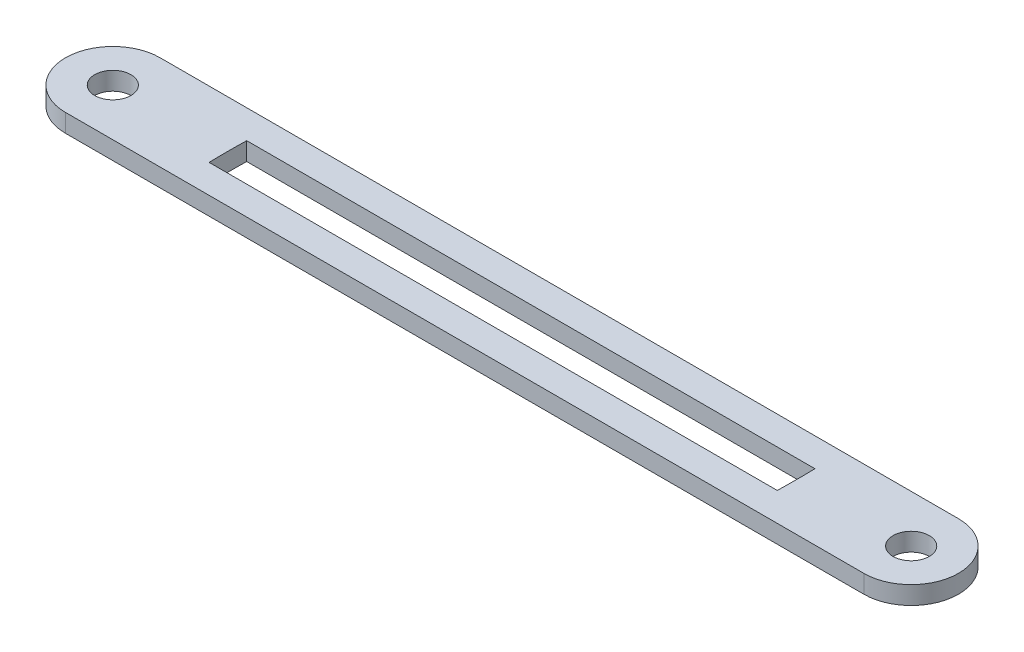
ISO-10303-21;
HEADER;
FILE_DESCRIPTION(('STEP AP214'),'2;1');
FILE_NAME('part.step','',(''),(''),'','','');
FILE_SCHEMA(('AUTOMOTIVE_DESIGN { 1 0 10303 214 1 1 1 1 }'));
ENDSEC;
DATA;
#1=APPLICATION_CONTEXT('core data for automotive mechanical design processes');
#2=APPLICATION_PROTOCOL_DEFINITION('international standard','automotive_design',2000,#1);
#3=PRODUCT_CONTEXT('',#1,'mechanical');
#4=PRODUCT('Part','Part','',(#3));
#5=PRODUCT_RELATED_PRODUCT_CATEGORY('part','',(#4));
#6=PRODUCT_DEFINITION_FORMATION('','',#4);
#7=PRODUCT_DEFINITION_CONTEXT('part definition',#1,'design');
#8=PRODUCT_DEFINITION('design','',#6,#7);
#9=PRODUCT_DEFINITION_SHAPE('','',#8);
#10=(LENGTH_UNIT() NAMED_UNIT(*) SI_UNIT(.MILLI.,.METRE.));
#11=(NAMED_UNIT(*) PLANE_ANGLE_UNIT() SI_UNIT($,.RADIAN.));
#12=(NAMED_UNIT(*) SI_UNIT($,.STERADIAN.) SOLID_ANGLE_UNIT());
#13=UNCERTAINTY_MEASURE_WITH_UNIT(LENGTH_MEASURE(1.E-05),#10,'distance_accuracy_value','');
#14=(GEOMETRIC_REPRESENTATION_CONTEXT(3) GLOBAL_UNCERTAINTY_ASSIGNED_CONTEXT((#13)) GLOBAL_UNIT_ASSIGNED_CONTEXT((#10,
#11,#12)) REPRESENTATION_CONTEXT('',''));
#15=CARTESIAN_POINT('',(0.,0.,0.));
#16=DIRECTION('',(0.,0.,1.));
#17=DIRECTION('',(1.,0.,0.));
#18=AXIS2_PLACEMENT_3D('',#15,#16,#17);
#19=CARTESIAN_POINT('',(0.,0.79375,4.15));
#20=DIRECTION('',(0.,0.,-1.));
#21=DIRECTION('',(-1.,0.,0.));
#22=AXIS2_PLACEMENT_3D('',#19,#20,#21);
#23=PLANE('',#22);
#24=DIRECTION('',(1.,0.,0.));
#25=VECTOR('',#24,1.);
#26=CARTESIAN_POINT('',(0.,-0.79375,4.15));
#27=LINE('',#26,#25);
#28=CARTESIAN_POINT('',(-35.,-0.79375,4.14999999999999));
#29=VERTEX_POINT('',#28);
#30=CARTESIAN_POINT('',(35.,-0.79375,4.15));
#31=VERTEX_POINT('',#30);
#32=EDGE_CURVE('E146',#29,#31,#27,.T.);
#33=ORIENTED_EDGE('',*,*,#32,.T.);
#34=DIRECTION('',(0.,-1.,0.));
#35=VECTOR('',#34,1.);
#36=CARTESIAN_POINT('',(35.,0.79375,4.15));
#37=LINE('',#36,#35);
#38=CARTESIAN_POINT('',(35.,0.79375,4.15));
#39=VERTEX_POINT('',#38);
#40=EDGE_CURVE('E11',#39,#31,#37,.T.);
#41=ORIENTED_EDGE('',*,*,#40,.F.);
#42=DIRECTION('',(1.,0.,0.));
#43=VECTOR('',#42,1.);
#44=CARTESIAN_POINT('',(0.,0.79375,4.15));
#45=LINE('',#44,#43);
#46=CARTESIAN_POINT('',(-35.,0.79375,4.14999999999999));
#47=VERTEX_POINT('',#46);
#48=EDGE_CURVE('E116',#47,#39,#45,.T.);
#49=ORIENTED_EDGE('',*,*,#48,.F.);
#50=DIRECTION('',(0.,-1.,0.));
#51=VECTOR('',#50,1.);
#52=CARTESIAN_POINT('',(-35.,0.79375,4.14999999999999));
#53=LINE('',#52,#51);
#54=EDGE_CURVE('E153',#47,#29,#53,.T.);
#55=ORIENTED_EDGE('',*,*,#54,.T.);
#56=EDGE_LOOP('',(#33,#41,#49,#55));
#57=FACE_BOUND('',#56,.T.);
#58=ADVANCED_FACE('F35',(#57),#23,.F.);
#59=CARTESIAN_POINT('',(35.,0.79375,0.));
#60=DIRECTION('',(0.,-1.,0.));
#61=DIRECTION('',(0.,0.,-1.));
#62=AXIS2_PLACEMENT_3D('',#59,#60,#61);
#63=CYLINDRICAL_SURFACE('',#62,4.15);
#64=CARTESIAN_POINT('',(35.,-0.79375,0.));
#65=DIRECTION('',(0.,1.,0.));
#66=DIRECTION('',(0.,0.,1.));
#67=AXIS2_PLACEMENT_3D('',#64,#65,#66);
#68=CIRCLE('',#67,4.15);
#69=CARTESIAN_POINT('',(35.,-0.79375,-4.15));
#70=VERTEX_POINT('',#69);
#71=EDGE_CURVE('E121',#31,#70,#68,.T.);
#72=ORIENTED_EDGE('',*,*,#71,.T.);
#73=DIRECTION('',(0.,-1.,0.));
#74=VECTOR('',#73,1.);
#75=CARTESIAN_POINT('',(35.,0.79375,-4.15));
#76=LINE('',#75,#74);
#77=CARTESIAN_POINT('',(35.,0.79375,-4.15));
#78=VERTEX_POINT('',#77);
#79=EDGE_CURVE('E45',#78,#70,#76,.T.);
#80=ORIENTED_EDGE('',*,*,#79,.F.);
#81=CARTESIAN_POINT('',(35.,0.79375,0.));
#82=DIRECTION('',(0.,1.,0.));
#83=DIRECTION('',(0.,0.,1.));
#84=AXIS2_PLACEMENT_3D('',#81,#82,#83);
#85=CIRCLE('',#84,4.15);
#86=EDGE_CURVE('E110',#39,#78,#85,.T.);
#87=ORIENTED_EDGE('',*,*,#86,.F.);
#88=ORIENTED_EDGE('',*,*,#40,.T.);
#89=EDGE_LOOP('',(#72,#80,#87,#88));
#90=FACE_BOUND('',#89,.T.);
#91=ADVANCED_FACE('F120',(#90),#63,.T.);
#92=CARTESIAN_POINT('',(0.,0.79375,-4.15));
#93=DIRECTION('',(0.,0.,1.));
#94=DIRECTION('',(1.,0.,0.));
#95=AXIS2_PLACEMENT_3D('',#92,#93,#94);
#96=PLANE('',#95);
#97=DIRECTION('',(-1.,0.,0.));
#98=VECTOR('',#97,1.);
#99=CARTESIAN_POINT('',(0.,-0.79375,-4.15));
#100=LINE('',#99,#98);
#101=CARTESIAN_POINT('',(-35.,-0.79375,-4.14999999999999));
#102=VERTEX_POINT('',#101);
#103=EDGE_CURVE('E83',#70,#102,#100,.T.);
#104=ORIENTED_EDGE('',*,*,#103,.T.);
#105=DIRECTION('',(0.,-1.,0.));
#106=VECTOR('',#105,1.);
#107=CARTESIAN_POINT('',(-35.,0.79375,-4.14999999999999));
#108=LINE('',#107,#106);
#109=CARTESIAN_POINT('',(-35.,0.79375,-4.14999999999999));
#110=VERTEX_POINT('',#109);
#111=EDGE_CURVE('E122',#110,#102,#108,.T.);
#112=ORIENTED_EDGE('',*,*,#111,.F.);
#113=DIRECTION('',(-1.,0.,0.));
#114=VECTOR('',#113,1.);
#115=CARTESIAN_POINT('',(0.,0.79375,-4.15));
#116=LINE('',#115,#114);
#117=EDGE_CURVE('E114',#78,#110,#116,.T.);
#118=ORIENTED_EDGE('',*,*,#117,.F.);
#119=ORIENTED_EDGE('',*,*,#79,.T.);
#120=EDGE_LOOP('',(#104,#112,#118,#119));
#121=FACE_BOUND('',#120,.T.);
#122=ADVANCED_FACE('F124',(#121),#96,.F.);
#123=CARTESIAN_POINT('',(35.,0.79375,0.));
#124=DIRECTION('',(0.,-1.,0.));
#125=DIRECTION('',(0.,0.,-1.));
#126=AXIS2_PLACEMENT_3D('',#123,#124,#125);
#127=CYLINDRICAL_SURFACE('',#126,59.9299769551078);
#128=CARTESIAN_POINT('',(35.,-0.79375,0.));
#129=DIRECTION('',(0.,1.,0.));
#130=DIRECTION('',(0.,0.,1.));
#131=AXIS2_PLACEMENT_3D('',#128,#129,#130);
#132=CIRCLE('',#131,59.9299769551078);
#133=CARTESIAN_POINT('',(-24.9072586406669,-0.79375,-1.64999999999999));
#134=VERTEX_POINT('',#133);
#135=CARTESIAN_POINT('',(-24.9072586406669,-0.79375,1.65));
#136=VERTEX_POINT('',#135);
#137=EDGE_CURVE('E130',#134,#136,#132,.T.);
#138=ORIENTED_EDGE('',*,*,#137,.F.);
#139=DIRECTION('',(0.,-1.,0.));
#140=VECTOR('',#139,1.);
#141=CARTESIAN_POINT('',(-24.9072586406669,0.79375,-1.64999999999999));
#142=LINE('',#141,#140);
#143=CARTESIAN_POINT('',(-24.9072586406669,0.79375,-1.64999999999999));
#144=VERTEX_POINT('',#143);
#145=EDGE_CURVE('E39',#144,#134,#142,.T.);
#146=ORIENTED_EDGE('',*,*,#145,.F.);
#147=CARTESIAN_POINT('',(35.,0.79375,0.));
#148=DIRECTION('',(0.,1.,0.));
#149=DIRECTION('',(0.,0.,1.));
#150=AXIS2_PLACEMENT_3D('',#147,#148,#149);
#151=CIRCLE('',#150,59.9299769551078);
#152=CARTESIAN_POINT('',(-24.9072586406669,0.79375,1.65));
#153=VERTEX_POINT('',#152);
#154=EDGE_CURVE('E152',#144,#153,#151,.T.);
#155=ORIENTED_EDGE('',*,*,#154,.T.);
#156=DIRECTION('',(0.,-1.,0.));
#157=VECTOR('',#156,1.);
#158=CARTESIAN_POINT('',(-24.9072586406669,0.79375,1.65));
#159=LINE('',#158,#157);
#160=EDGE_CURVE('E126',#153,#136,#159,.T.);
#161=ORIENTED_EDGE('',*,*,#160,.T.);
#162=EDGE_LOOP('',(#138,#146,#155,#161));
#163=FACE_BOUND('',#162,.T.);
#164=ADVANCED_FACE('F37',(#163),#127,.F.);
#165=CARTESIAN_POINT('',(0.,0.79375,-1.65));
#166=DIRECTION('',(0.,0.,-1.));
#167=DIRECTION('',(-1.,0.,0.));
#168=AXIS2_PLACEMENT_3D('',#165,#166,#167);
#169=PLANE('',#168);
#170=DIRECTION('',(1.,0.,0.));
#171=VECTOR('',#170,1.);
#172=CARTESIAN_POINT('',(0.,-0.79375,-1.65));
#173=LINE('',#172,#171);
#174=CARTESIAN_POINT('',(24.9072586406669,-0.79375,-1.65));
#175=VERTEX_POINT('',#174);
#176=EDGE_CURVE('E133',#134,#175,#173,.T.);
#177=ORIENTED_EDGE('',*,*,#176,.T.);
#178=DIRECTION('',(0.,-1.,0.));
#179=VECTOR('',#178,1.);
#180=CARTESIAN_POINT('',(24.9072586406669,0.79375,-1.65));
#181=LINE('',#180,#179);
#182=CARTESIAN_POINT('',(24.9072586406669,0.79375,-1.65));
#183=VERTEX_POINT('',#182);
#184=EDGE_CURVE('E159',#183,#175,#181,.T.);
#185=ORIENTED_EDGE('',*,*,#184,.F.);
#186=DIRECTION('',(1.,0.,0.));
#187=VECTOR('',#186,1.);
#188=CARTESIAN_POINT('',(0.,0.79375,-1.65));
#189=LINE('',#188,#187);
#190=EDGE_CURVE('E168',#144,#183,#189,.T.);
#191=ORIENTED_EDGE('',*,*,#190,.F.);
#192=ORIENTED_EDGE('',*,*,#145,.T.);
#193=EDGE_LOOP('',(#177,#185,#191,#192));
#194=FACE_BOUND('',#193,.T.);
#195=ADVANCED_FACE('F167',(#194),#169,.F.);
#196=CARTESIAN_POINT('',(-35.,0.79375,0.));
#197=DIRECTION('',(0.,-1.,0.));
#198=DIRECTION('',(0.,0.,-1.));
#199=AXIS2_PLACEMENT_3D('',#196,#197,#198);
#200=CYLINDRICAL_SURFACE('',#199,59.9299769551078);
#201=CARTESIAN_POINT('',(-35.,-0.79375,0.));
#202=DIRECTION('',(0.,1.,0.));
#203=DIRECTION('',(0.,0.,1.));
#204=AXIS2_PLACEMENT_3D('',#201,#202,#203);
#205=CIRCLE('',#204,59.9299769551078);
#206=CARTESIAN_POINT('',(24.9072586406669,-0.79375,1.64999999999999));
#207=VERTEX_POINT('',#206);
#208=EDGE_CURVE('E135',#175,#207,#205,.F.);
#209=ORIENTED_EDGE('',*,*,#208,.T.);
#210=DIRECTION('',(0.,-1.,0.));
#211=VECTOR('',#210,1.);
#212=CARTESIAN_POINT('',(24.9072586406669,0.79375,1.64999999999999));
#213=LINE('',#212,#211);
#214=CARTESIAN_POINT('',(24.9072586406669,0.79375,1.64999999999999));
#215=VERTEX_POINT('',#214);
#216=EDGE_CURVE('E157',#215,#207,#213,.T.);
#217=ORIENTED_EDGE('',*,*,#216,.F.);
#218=CARTESIAN_POINT('',(-35.,0.79375,0.));
#219=DIRECTION('',(0.,1.,0.));
#220=DIRECTION('',(0.,0.,1.));
#221=AXIS2_PLACEMENT_3D('',#218,#219,#220);
#222=CIRCLE('',#221,59.9299769551078);
#223=EDGE_CURVE('E181',#183,#215,#222,.F.);
#224=ORIENTED_EDGE('',*,*,#223,.F.);
#225=ORIENTED_EDGE('',*,*,#184,.T.);
#226=EDGE_LOOP('',(#209,#217,#224,#225));
#227=FACE_BOUND('',#226,.T.);
#228=ADVANCED_FACE('F180',(#227),#200,.F.);
#229=CARTESIAN_POINT('',(-35.,0.79375,0.));
#230=DIRECTION('',(0.,-1.,0.));
#231=DIRECTION('',(0.,0.,-1.));
#232=AXIS2_PLACEMENT_3D('',#229,#230,#231);
#233=CYLINDRICAL_SURFACE('',#232,1.5875);
#234=CARTESIAN_POINT('',(-35.,0.79375,0.));
#235=DIRECTION('',(0.,1.,0.));
#236=DIRECTION('',(0.,0.,1.));
#237=AXIS2_PLACEMENT_3D('',#234,#235,#236);
#238=CIRCLE('',#237,1.5875);
#239=CARTESIAN_POINT('',(-35.,0.79375,1.5875));
#240=VERTEX_POINT('',#239);
#241=EDGE_CURVE('E191',#240,#240,#238,.T.);
#242=ORIENTED_EDGE('',*,*,#241,.T.);
#243=EDGE_LOOP('',(#242));
#244=FACE_BOUND('',#243,.T.);
#245=CARTESIAN_POINT('',(-35.,-0.79375,0.));
#246=DIRECTION('',(0.,1.,0.));
#247=DIRECTION('',(0.,0.,1.));
#248=AXIS2_PLACEMENT_3D('',#245,#246,#247);
#249=CIRCLE('',#248,1.5875);
#250=CARTESIAN_POINT('',(-35.,-0.79375,1.5875));
#251=VERTEX_POINT('',#250);
#252=EDGE_CURVE('E143',#251,#251,#249,.T.);
#253=ORIENTED_EDGE('',*,*,#252,.F.);
#254=EDGE_LOOP('',(#253));
#255=FACE_BOUND('',#254,.T.);
#256=ADVANCED_FACE('F195',(#244,#255),#233,.F.);
#257=CARTESIAN_POINT('',(35.,0.79375,0.));
#258=DIRECTION('',(0.,-1.,0.));
#259=DIRECTION('',(0.,0.,-1.));
#260=AXIS2_PLACEMENT_3D('',#257,#258,#259);
#261=CYLINDRICAL_SURFACE('',#260,1.5875);
#262=CARTESIAN_POINT('',(35.,0.79375,0.));
#263=DIRECTION('',(0.,1.,0.));
#264=DIRECTION('',(0.,0.,1.));
#265=AXIS2_PLACEMENT_3D('',#262,#263,#264);
#266=CIRCLE('',#265,1.5875);
#267=CARTESIAN_POINT('',(35.,0.79375,1.58749999999999));
#268=VERTEX_POINT('',#267);
#269=EDGE_CURVE('E184',#268,#268,#266,.T.);
#270=ORIENTED_EDGE('',*,*,#269,.T.);
#271=EDGE_LOOP('',(#270));
#272=FACE_BOUND('',#271,.T.);
#273=CARTESIAN_POINT('',(35.,-0.79375,0.));
#274=DIRECTION('',(0.,1.,0.));
#275=DIRECTION('',(0.,0.,1.));
#276=AXIS2_PLACEMENT_3D('',#273,#274,#275);
#277=CIRCLE('',#276,1.5875);
#278=CARTESIAN_POINT('',(35.,-0.79375,1.58749999999999));
#279=VERTEX_POINT('',#278);
#280=EDGE_CURVE('E140',#279,#279,#277,.T.);
#281=ORIENTED_EDGE('',*,*,#280,.F.);
#282=EDGE_LOOP('',(#281));
#283=FACE_BOUND('',#282,.T.);
#284=ADVANCED_FACE('F219',(#272,#283),#261,.F.);
#285=CARTESIAN_POINT('',(0.,0.79375,1.64999999999999));
#286=DIRECTION('',(0.,0.,1.));
#287=DIRECTION('',(1.,0.,0.));
#288=AXIS2_PLACEMENT_3D('',#285,#286,#287);
#289=PLANE('',#288);
#290=DIRECTION('',(-1.,0.,0.));
#291=VECTOR('',#290,1.);
#292=CARTESIAN_POINT('',(0.,-0.79375,1.64999999999999));
#293=LINE('',#292,#291);
#294=EDGE_CURVE('E137',#207,#136,#293,.T.);
#295=ORIENTED_EDGE('',*,*,#294,.T.);
#296=ORIENTED_EDGE('',*,*,#160,.F.);
#297=DIRECTION('',(-1.,0.,0.));
#298=VECTOR('',#297,1.);
#299=CARTESIAN_POINT('',(0.,0.79375,1.64999999999999));
#300=LINE('',#299,#298);
#301=EDGE_CURVE('E179',#215,#153,#300,.T.);
#302=ORIENTED_EDGE('',*,*,#301,.F.);
#303=ORIENTED_EDGE('',*,*,#216,.T.);
#304=EDGE_LOOP('',(#295,#296,#302,#303));
#305=FACE_BOUND('',#304,.T.);
#306=ADVANCED_FACE('F177',(#305),#289,.F.);
#307=CARTESIAN_POINT('',(-35.,0.79375,0.));
#308=DIRECTION('',(0.,-1.,0.));
#309=DIRECTION('',(0.,0.,-1.));
#310=AXIS2_PLACEMENT_3D('',#307,#308,#309);
#311=CYLINDRICAL_SURFACE('',#310,4.14999999999999);
#312=CARTESIAN_POINT('',(-35.,-0.79375,0.));
#313=DIRECTION('',(0.,1.,0.));
#314=DIRECTION('',(0.,0.,1.));
#315=AXIS2_PLACEMENT_3D('',#312,#313,#314);
#316=CIRCLE('',#315,4.14999999999999);
#317=EDGE_CURVE('E89',#102,#29,#316,.T.);
#318=ORIENTED_EDGE('',*,*,#317,.T.);
#319=ORIENTED_EDGE('',*,*,#54,.F.);
#320=CARTESIAN_POINT('',(-35.,0.79375,0.));
#321=DIRECTION('',(0.,1.,0.));
#322=DIRECTION('',(0.,0.,1.));
#323=AXIS2_PLACEMENT_3D('',#320,#321,#322);
#324=CIRCLE('',#323,4.14999999999999);
#325=EDGE_CURVE('E54',#110,#47,#324,.T.);
#326=ORIENTED_EDGE('',*,*,#325,.F.);
#327=ORIENTED_EDGE('',*,*,#111,.T.);
#328=EDGE_LOOP('',(#318,#319,#326,#327));
#329=FACE_BOUND('',#328,.T.);
#330=ADVANCED_FACE('F199',(#329),#311,.T.);
#331=CARTESIAN_POINT('',(0.,0.79375,0.));
#332=DIRECTION('',(0.,1.,0.));
#333=DIRECTION('',(0.,0.,1.));
#334=AXIS2_PLACEMENT_3D('',#331,#332,#333);
#335=PLANE('',#334);
#336=ORIENTED_EDGE('',*,*,#154,.F.);
#337=ORIENTED_EDGE('',*,*,#190,.T.);
#338=ORIENTED_EDGE('',*,*,#223,.T.);
#339=ORIENTED_EDGE('',*,*,#301,.T.);
#340=EDGE_LOOP('',(#336,#337,#338,#339));
#341=FACE_BOUND('',#340,.T.);
#342=ORIENTED_EDGE('',*,*,#269,.F.);
#343=EDGE_LOOP('',(#342));
#344=FACE_BOUND('',#343,.T.);
#345=ORIENTED_EDGE('',*,*,#241,.F.);
#346=EDGE_LOOP('',(#345));
#347=FACE_BOUND('',#346,.T.);
#348=ORIENTED_EDGE('',*,*,#48,.T.);
#349=ORIENTED_EDGE('',*,*,#86,.T.);
#350=ORIENTED_EDGE('',*,*,#117,.T.);
#351=ORIENTED_EDGE('',*,*,#325,.T.);
#352=EDGE_LOOP('',(#348,#349,#350,#351));
#353=FACE_BOUND('',#352,.T.);
#354=ADVANCED_FACE('F112',(#341,#344,#347,#353),#335,.T.);
#355=CARTESIAN_POINT('',(0.,-0.79375,0.));
#356=DIRECTION('',(0.,1.,0.));
#357=DIRECTION('',(0.,0.,1.));
#358=AXIS2_PLACEMENT_3D('',#355,#356,#357);
#359=PLANE('',#358);
#360=ORIENTED_EDGE('',*,*,#137,.T.);
#361=ORIENTED_EDGE('',*,*,#294,.F.);
#362=ORIENTED_EDGE('',*,*,#208,.F.);
#363=ORIENTED_EDGE('',*,*,#176,.F.);
#364=EDGE_LOOP('',(#360,#361,#362,#363));
#365=FACE_BOUND('',#364,.T.);
#366=ORIENTED_EDGE('',*,*,#280,.T.);
#367=EDGE_LOOP('',(#366));
#368=FACE_BOUND('',#367,.T.);
#369=ORIENTED_EDGE('',*,*,#252,.T.);
#370=EDGE_LOOP('',(#369));
#371=FACE_BOUND('',#370,.T.);
#372=ORIENTED_EDGE('',*,*,#32,.F.);
#373=ORIENTED_EDGE('',*,*,#317,.F.);
#374=ORIENTED_EDGE('',*,*,#103,.F.);
#375=ORIENTED_EDGE('',*,*,#71,.F.);
#376=EDGE_LOOP('',(#372,#373,#374,#375));
#377=FACE_BOUND('',#376,.T.);
#378=ADVANCED_FACE('F171',(#365,#368,#371,#377),#359,.F.);
#379=CLOSED_SHELL('',(#58,#91,#122,#164,#195,#228,#256,#284,#306,#330,#354,#378));
#380=MANIFOLD_SOLID_BREP('B2',#379);
#381=ADVANCED_BREP_SHAPE_REPRESENTATION('',(#18,#380),#14);
#382=SHAPE_DEFINITION_REPRESENTATION(#9,#381);
ENDSEC;
END-ISO-10303-21;
